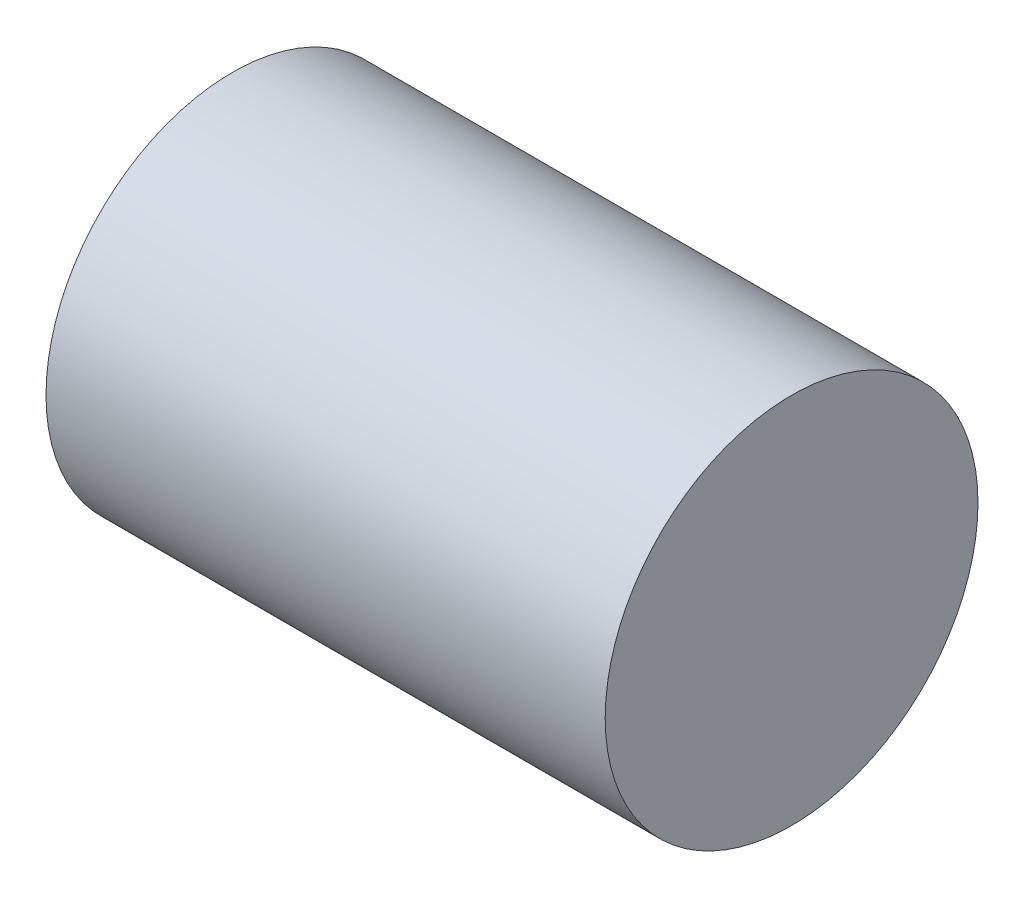
ISO-10303-21;
HEADER;
FILE_DESCRIPTION(('STEP AP214'),'2;1');
FILE_NAME('part.step','',(''),(''),'','','');
FILE_SCHEMA(('AUTOMOTIVE_DESIGN { 1 0 10303 214 1 1 1 1 }'));
ENDSEC;
DATA;
#1=APPLICATION_CONTEXT('core data for automotive mechanical design processes');
#2=APPLICATION_PROTOCOL_DEFINITION('international standard','automotive_design',2000,#1);
#3=PRODUCT_CONTEXT('',#1,'mechanical');
#4=PRODUCT('Part','Part','',(#3));
#5=PRODUCT_RELATED_PRODUCT_CATEGORY('part','',(#4));
#6=PRODUCT_DEFINITION_FORMATION('','',#4);
#7=PRODUCT_DEFINITION_CONTEXT('part definition',#1,'design');
#8=PRODUCT_DEFINITION('design','',#6,#7);
#9=PRODUCT_DEFINITION_SHAPE('','',#8);
#10=(LENGTH_UNIT() NAMED_UNIT(*) SI_UNIT(.MILLI.,.METRE.));
#11=(NAMED_UNIT(*) PLANE_ANGLE_UNIT() SI_UNIT($,.RADIAN.));
#12=(NAMED_UNIT(*) SI_UNIT($,.STERADIAN.) SOLID_ANGLE_UNIT());
#13=UNCERTAINTY_MEASURE_WITH_UNIT(LENGTH_MEASURE(1.E-05),#10,'distance_accuracy_value','');
#14=(GEOMETRIC_REPRESENTATION_CONTEXT(3) GLOBAL_UNCERTAINTY_ASSIGNED_CONTEXT((#13)) GLOBAL_UNIT_ASSIGNED_CONTEXT((#10,
#11,#12)) REPRESENTATION_CONTEXT('',''));
#15=CARTESIAN_POINT('',(0.,0.,0.));
#16=DIRECTION('',(0.,0.,1.));
#17=DIRECTION('',(1.,0.,0.));
#18=AXIS2_PLACEMENT_3D('',#15,#16,#17);
#19=CARTESIAN_POINT('',(0.,0.,0.));
#20=DIRECTION('',(1.,0.,0.));
#21=DIRECTION('',(0.,0.,-1.));
#22=AXIS2_PLACEMENT_3D('',#19,#20,#21);
#23=PLANE('',#22);
#24=CARTESIAN_POINT('',(0.,0.,0.));
#25=DIRECTION('',(1.,0.,0.));
#26=DIRECTION('',(0.,0.,-1.));
#27=AXIS2_PLACEMENT_3D('',#24,#25,#26);
#28=CIRCLE('',#27,25.4);
#29=CARTESIAN_POINT('',(0.,0.,-25.4));
#30=VERTEX_POINT('',#29);
#31=EDGE_CURVE('E10',#30,#30,#28,.T.);
#32=ORIENTED_EDGE('',*,*,#31,.T.);
#33=EDGE_LOOP('',(#32));
#34=FACE_BOUND('',#33,.T.);
#35=ADVANCED_FACE('F38',(#34),#23,.T.);
#36=CARTESIAN_POINT('',(64.3305177111717,0.,0.));
#37=DIRECTION('',(1.,0.,0.));
#38=DIRECTION('',(0.,0.,-1.));
#39=AXIS2_PLACEMENT_3D('',#36,#37,#38);
#40=CYLINDRICAL_SURFACE('',#39,25.4);
#41=CARTESIAN_POINT('',(-76.2,0.,0.));
#42=DIRECTION('',(1.,0.,0.));
#43=DIRECTION('',(0.,0.,-1.));
#44=AXIS2_PLACEMENT_3D('',#41,#42,#43);
#45=CIRCLE('',#44,25.4);
#46=CARTESIAN_POINT('',(-76.2,0.,-25.4));
#47=VERTEX_POINT('',#46);
#48=EDGE_CURVE('E44',#47,#47,#45,.T.);
#49=ORIENTED_EDGE('',*,*,#48,.T.);
#50=EDGE_LOOP('',(#49));
#51=FACE_BOUND('',#50,.T.);
#52=ORIENTED_EDGE('',*,*,#31,.F.);
#53=EDGE_LOOP('',(#52));
#54=FACE_BOUND('',#53,.T.);
#55=ADVANCED_FACE('F50',(#51,#54),#40,.T.);
#56=CARTESIAN_POINT('',(-76.2,0.,0.));
#57=DIRECTION('',(-1.,0.,0.));
#58=DIRECTION('',(0.,0.,1.));
#59=AXIS2_PLACEMENT_3D('',#56,#57,#58);
#60=PLANE('',#59);
#61=ORIENTED_EDGE('',*,*,#48,.F.);
#62=EDGE_LOOP('',(#61));
#63=FACE_BOUND('',#62,.T.);
#64=ADVANCED_FACE('F53',(#63),#60,.T.);
#65=CLOSED_SHELL('',(#35,#55,#64));
#66=MANIFOLD_SOLID_BREP('B2',#65);
#67=ADVANCED_BREP_SHAPE_REPRESENTATION('',(#18,#66),#14);
#68=SHAPE_DEFINITION_REPRESENTATION(#9,#67);
ENDSEC;
END-ISO-10303-21;
